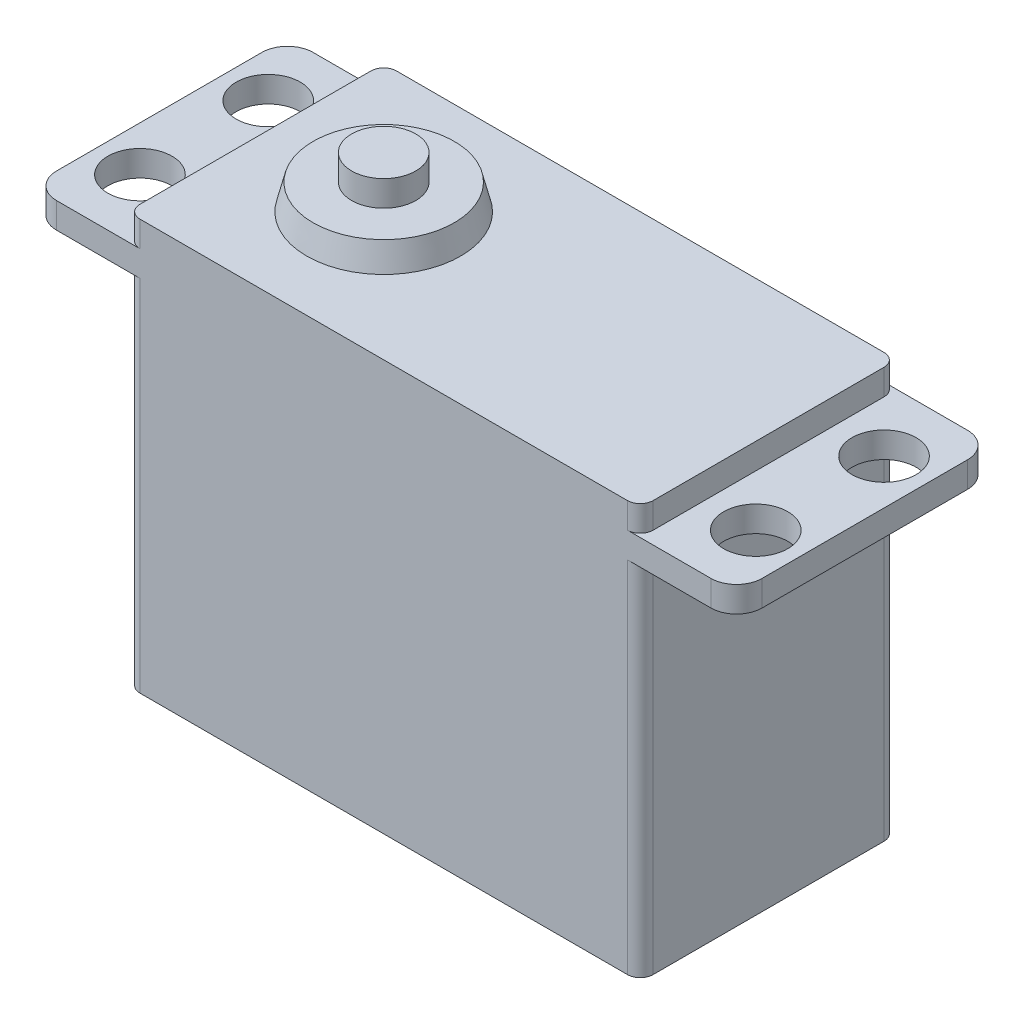
ISO-10303-21;
HEADER;
FILE_DESCRIPTION(('STEP AP214'),'2;1');
FILE_NAME('part.step','',(''),(''),'','','');
FILE_SCHEMA(('AUTOMOTIVE_DESIGN { 1 0 10303 214 1 1 1 1 }'));
ENDSEC;
DATA;
#1=APPLICATION_CONTEXT('core data for automotive mechanical design processes');
#2=APPLICATION_PROTOCOL_DEFINITION('international standard','automotive_design',2000,#1);
#3=PRODUCT_CONTEXT('',#1,'mechanical');
#4=PRODUCT('Part','Part','',(#3));
#5=PRODUCT_RELATED_PRODUCT_CATEGORY('part','',(#4));
#6=PRODUCT_DEFINITION_FORMATION('','',#4);
#7=PRODUCT_DEFINITION_CONTEXT('part definition',#1,'design');
#8=PRODUCT_DEFINITION('design','',#6,#7);
#9=PRODUCT_DEFINITION_SHAPE('','',#8);
#10=(LENGTH_UNIT() NAMED_UNIT(*) SI_UNIT(.MILLI.,.METRE.));
#11=(NAMED_UNIT(*) PLANE_ANGLE_UNIT() SI_UNIT($,.RADIAN.));
#12=(NAMED_UNIT(*) SI_UNIT($,.STERADIAN.) SOLID_ANGLE_UNIT());
#13=UNCERTAINTY_MEASURE_WITH_UNIT(LENGTH_MEASURE(1.E-05),#10,'distance_accuracy_value','');
#14=(GEOMETRIC_REPRESENTATION_CONTEXT(3) GLOBAL_UNCERTAINTY_ASSIGNED_CONTEXT((#13)) GLOBAL_UNIT_ASSIGNED_CONTEXT((#10,
#11,#12)) REPRESENTATION_CONTEXT('',''));
#15=CARTESIAN_POINT('',(0.,0.,0.));
#16=DIRECTION('',(0.,0.,1.));
#17=DIRECTION('',(1.,0.,0.));
#18=AXIS2_PLACEMENT_3D('',#15,#16,#17);
#19=CARTESIAN_POINT('',(0.,2.,0.));
#20=DIRECTION('',(0.,-1.,0.));
#21=DIRECTION('',(0.,0.,-1.));
#22=AXIS2_PLACEMENT_3D('',#19,#20,#21);
#23=PLANE('',#22);
#24=CARTESIAN_POINT('',(3.5,2.,-5.));
#25=DIRECTION('',(0.,1.,0.));
#26=DIRECTION('',(0.,0.,1.));
#27=AXIS2_PLACEMENT_3D('',#24,#25,#26);
#28=CIRCLE('',#27,2.5);
#29=CARTESIAN_POINT('',(3.5,2.,-2.5));
#30=VERTEX_POINT('',#29);
#31=EDGE_CURVE('E376',#30,#30,#28,.T.);
#32=ORIENTED_EDGE('',*,*,#31,.F.);
#33=EDGE_LOOP('',(#32));
#34=FACE_BOUND('',#33,.T.);
#35=CARTESIAN_POINT('',(3.5,2.,-15.));
#36=DIRECTION('',(0.,1.,0.));
#37=DIRECTION('',(0.,0.,1.));
#38=AXIS2_PLACEMENT_3D('',#35,#36,#37);
#39=CIRCLE('',#38,2.5);
#40=CARTESIAN_POINT('',(3.5,2.,-12.5));
#41=VERTEX_POINT('',#40);
#42=EDGE_CURVE('E382',#41,#41,#39,.T.);
#43=ORIENTED_EDGE('',*,*,#42,.F.);
#44=EDGE_LOOP('',(#43));
#45=FACE_BOUND('',#44,.T.);
#46=DIRECTION('',(0.,0.,1.));
#47=VECTOR('',#46,1.);
#48=CARTESIAN_POINT('',(7.5,2.,-20.));
#49=LINE('',#48,#47);
#50=CARTESIAN_POINT('',(7.5,2.,-19.));
#51=VERTEX_POINT('',#50);
#52=CARTESIAN_POINT('',(7.5,2.,-1.));
#53=VERTEX_POINT('',#52);
#54=EDGE_CURVE('E734',#51,#53,#49,.T.);
#55=ORIENTED_EDGE('',*,*,#54,.F.);
#56=CARTESIAN_POINT('',(8.5,2.,-19.));
#57=DIRECTION('',(0.,-1.,0.));
#58=DIRECTION('',(0.,0.,-1.));
#59=AXIS2_PLACEMENT_3D('',#56,#57,#58);
#60=CIRCLE('',#59,1.);
#61=CARTESIAN_POINT('',(8.5,2.,-20.));
#62=VERTEX_POINT('',#61);
#63=EDGE_CURVE('E324',#51,#62,#60,.T.);
#64=ORIENTED_EDGE('',*,*,#63,.T.);
#65=DIRECTION('',(-1.,0.,0.));
#66=VECTOR('',#65,1.);
#67=CARTESIAN_POINT('',(0.,2.,-20.));
#68=LINE('',#67,#66);
#69=CARTESIAN_POINT('',(2.,2.,-20.));
#70=VERTEX_POINT('',#69);
#71=EDGE_CURVE('E393',#62,#70,#68,.T.);
#72=ORIENTED_EDGE('',*,*,#71,.T.);
#73=CARTESIAN_POINT('',(2.,2.,-18.));
#74=DIRECTION('',(0.,-1.,0.));
#75=DIRECTION('',(0.,0.,-1.));
#76=AXIS2_PLACEMENT_3D('',#73,#74,#75);
#77=CIRCLE('',#76,2.);
#78=CARTESIAN_POINT('',(0.,2.,-18.));
#79=VERTEX_POINT('',#78);
#80=EDGE_CURVE('E246',#70,#79,#77,.F.);
#81=ORIENTED_EDGE('',*,*,#80,.T.);
#82=DIRECTION('',(0.,0.,1.));
#83=VECTOR('',#82,1.);
#84=CARTESIAN_POINT('',(0.,2.,0.));
#85=LINE('',#84,#83);
#86=CARTESIAN_POINT('',(0.,2.,-2.));
#87=VERTEX_POINT('',#86);
#88=EDGE_CURVE('E225',#79,#87,#85,.T.);
#89=ORIENTED_EDGE('',*,*,#88,.T.);
#90=CARTESIAN_POINT('',(2.,2.,-2.));
#91=DIRECTION('',(0.,-1.,0.));
#92=DIRECTION('',(0.,0.,-1.));
#93=AXIS2_PLACEMENT_3D('',#90,#91,#92);
#94=CIRCLE('',#93,2.);
#95=CARTESIAN_POINT('',(2.,2.,0.));
#96=VERTEX_POINT('',#95);
#97=EDGE_CURVE('E248',#87,#96,#94,.F.);
#98=ORIENTED_EDGE('',*,*,#97,.T.);
#99=DIRECTION('',(1.,0.,0.));
#100=VECTOR('',#99,1.);
#101=CARTESIAN_POINT('',(0.,2.,0.));
#102=LINE('',#101,#100);
#103=CARTESIAN_POINT('',(8.5,2.,0.));
#104=VERTEX_POINT('',#103);
#105=EDGE_CURVE('E388',#96,#104,#102,.T.);
#106=ORIENTED_EDGE('',*,*,#105,.T.);
#107=CARTESIAN_POINT('',(8.5,2.,-1.));
#108=DIRECTION('',(0.,-1.,0.));
#109=DIRECTION('',(0.,0.,-1.));
#110=AXIS2_PLACEMENT_3D('',#107,#108,#109);
#111=CIRCLE('',#110,1.);
#112=EDGE_CURVE('E327',#104,#53,#111,.T.);
#113=ORIENTED_EDGE('',*,*,#112,.T.);
#114=EDGE_LOOP('',(#55,#64,#72,#81,#89,#98,#106,#113));
#115=FACE_BOUND('',#114,.T.);
#116=ADVANCED_FACE('F33',(#34,#45,#115),#23,.F.);
#117=CARTESIAN_POINT('',(51.5,2.,-5.));
#118=DIRECTION('',(0.,1.,0.));
#119=DIRECTION('',(0.,0.,1.));
#120=AXIS2_PLACEMENT_3D('',#117,#118,#119);
#121=CIRCLE('',#120,2.5);
#122=CARTESIAN_POINT('',(51.5,2.,-2.5));
#123=VERTEX_POINT('',#122);
#124=EDGE_CURVE('E355',#123,#123,#121,.T.);
#125=ORIENTED_EDGE('',*,*,#124,.F.);
#126=EDGE_LOOP('',(#125));
#127=FACE_BOUND('',#126,.T.);
#128=CARTESIAN_POINT('',(51.5,2.,-15.));
#129=DIRECTION('',(0.,1.,0.));
#130=DIRECTION('',(0.,0.,1.));
#131=AXIS2_PLACEMENT_3D('',#128,#129,#130);
#132=CIRCLE('',#131,2.5);
#133=CARTESIAN_POINT('',(51.5,2.,-12.5));
#134=VERTEX_POINT('',#133);
#135=EDGE_CURVE('E370',#134,#134,#132,.T.);
#136=ORIENTED_EDGE('',*,*,#135,.F.);
#137=EDGE_LOOP('',(#136));
#138=FACE_BOUND('',#137,.T.);
#139=DIRECTION('',(0.,0.,-1.));
#140=VECTOR('',#139,1.);
#141=CARTESIAN_POINT('',(47.5,2.,-20.));
#142=LINE('',#141,#140);
#143=CARTESIAN_POINT('',(47.5,2.,-1.));
#144=VERTEX_POINT('',#143);
#145=CARTESIAN_POINT('',(47.5,2.,-19.));
#146=VERTEX_POINT('',#145);
#147=EDGE_CURVE('E739',#144,#146,#142,.T.);
#148=ORIENTED_EDGE('',*,*,#147,.F.);
#149=CARTESIAN_POINT('',(46.5,2.,-1.));
#150=DIRECTION('',(0.,-1.,0.));
#151=DIRECTION('',(0.,0.,-1.));
#152=AXIS2_PLACEMENT_3D('',#149,#150,#151);
#153=CIRCLE('',#152,1.);
#154=CARTESIAN_POINT('',(46.5,2.,0.));
#155=VERTEX_POINT('',#154);
#156=EDGE_CURVE('E321',#144,#155,#153,.T.);
#157=ORIENTED_EDGE('',*,*,#156,.T.);
#158=CARTESIAN_POINT('',(53.,2.,0.));
#159=VERTEX_POINT('',#158);
#160=EDGE_CURVE('E229',#155,#159,#102,.T.);
#161=ORIENTED_EDGE('',*,*,#160,.T.);
#162=CARTESIAN_POINT('',(53.,2.,-2.));
#163=DIRECTION('',(0.,-1.,0.));
#164=DIRECTION('',(0.,0.,-1.));
#165=AXIS2_PLACEMENT_3D('',#162,#163,#164);
#166=CIRCLE('',#165,2.);
#167=CARTESIAN_POINT('',(55.,2.,-2.));
#168=VERTEX_POINT('',#167);
#169=EDGE_CURVE('E250',#159,#168,#166,.F.);
#170=ORIENTED_EDGE('',*,*,#169,.T.);
#171=DIRECTION('',(0.,0.,-1.));
#172=VECTOR('',#171,1.);
#173=CARTESIAN_POINT('',(55.,2.,0.));
#174=LINE('',#173,#172);
#175=CARTESIAN_POINT('',(55.,2.,-18.));
#176=VERTEX_POINT('',#175);
#177=EDGE_CURVE('E390',#168,#176,#174,.T.);
#178=ORIENTED_EDGE('',*,*,#177,.T.);
#179=CARTESIAN_POINT('',(53.,2.,-18.));
#180=DIRECTION('',(0.,-1.,0.));
#181=DIRECTION('',(0.,0.,-1.));
#182=AXIS2_PLACEMENT_3D('',#179,#180,#181);
#183=CIRCLE('',#182,2.);
#184=CARTESIAN_POINT('',(53.,2.,-20.));
#185=VERTEX_POINT('',#184);
#186=EDGE_CURVE('E252',#176,#185,#183,.F.);
#187=ORIENTED_EDGE('',*,*,#186,.T.);
#188=CARTESIAN_POINT('',(46.5,2.,-20.));
#189=VERTEX_POINT('',#188);
#190=EDGE_CURVE('E216',#185,#189,#68,.T.);
#191=ORIENTED_EDGE('',*,*,#190,.T.);
#192=CARTESIAN_POINT('',(46.5,2.,-19.));
#193=DIRECTION('',(0.,-1.,0.));
#194=DIRECTION('',(0.,0.,-1.));
#195=AXIS2_PLACEMENT_3D('',#192,#193,#194);
#196=CIRCLE('',#195,1.);
#197=EDGE_CURVE('E319',#189,#146,#196,.T.);
#198=ORIENTED_EDGE('',*,*,#197,.T.);
#199=EDGE_LOOP('',(#148,#157,#161,#170,#178,#187,#191,#198));
#200=FACE_BOUND('',#199,.T.);
#201=ADVANCED_FACE('F406',(#127,#138,#200),#23,.F.);
#202=CARTESIAN_POINT('',(0.,0.,0.));
#203=DIRECTION('',(0.,-1.,0.));
#204=DIRECTION('',(0.,0.,-1.));
#205=AXIS2_PLACEMENT_3D('',#202,#203,#204);
#206=PLANE('',#205);
#207=DIRECTION('',(0.,0.,-1.));
#208=VECTOR('',#207,1.);
#209=CARTESIAN_POINT('',(7.5,0.,0.));
#210=LINE('',#209,#208);
#211=CARTESIAN_POINT('',(7.5,0.,-1.));
#212=VERTEX_POINT('',#211);
#213=CARTESIAN_POINT('',(7.5,0.,-19.));
#214=VERTEX_POINT('',#213);
#215=EDGE_CURVE('E336',#212,#214,#210,.T.);
#216=ORIENTED_EDGE('',*,*,#215,.F.);
#217=CARTESIAN_POINT('',(8.5,0.,-1.));
#218=DIRECTION('',(0.,-1.,0.));
#219=DIRECTION('',(0.,0.,-1.));
#220=AXIS2_PLACEMENT_3D('',#217,#218,#219);
#221=CIRCLE('',#220,1.);
#222=CARTESIAN_POINT('',(8.5,0.,0.));
#223=VERTEX_POINT('',#222);
#224=EDGE_CURVE('E41',#212,#223,#221,.F.);
#225=ORIENTED_EDGE('',*,*,#224,.T.);
#226=DIRECTION('',(1.,0.,0.));
#227=VECTOR('',#226,1.);
#228=CARTESIAN_POINT('',(0.,0.,0.));
#229=LINE('',#228,#227);
#230=CARTESIAN_POINT('',(2.,0.,0.));
#231=VERTEX_POINT('',#230);
#232=EDGE_CURVE('E335',#231,#223,#229,.T.);
#233=ORIENTED_EDGE('',*,*,#232,.F.);
#234=CARTESIAN_POINT('',(2.,0.,-2.));
#235=DIRECTION('',(0.,-1.,0.));
#236=DIRECTION('',(0.,0.,-1.));
#237=AXIS2_PLACEMENT_3D('',#234,#235,#236);
#238=CIRCLE('',#237,2.);
#239=CARTESIAN_POINT('',(0.,0.,-2.));
#240=VERTEX_POINT('',#239);
#241=EDGE_CURVE('E239',#231,#240,#238,.T.);
#242=ORIENTED_EDGE('',*,*,#241,.T.);
#243=DIRECTION('',(0.,0.,1.));
#244=VECTOR('',#243,1.);
#245=CARTESIAN_POINT('',(0.,0.,0.));
#246=LINE('',#245,#244);
#247=CARTESIAN_POINT('',(0.,0.,-18.));
#248=VERTEX_POINT('',#247);
#249=EDGE_CURVE('E385',#248,#240,#246,.T.);
#250=ORIENTED_EDGE('',*,*,#249,.F.);
#251=CARTESIAN_POINT('',(2.,0.,-18.));
#252=DIRECTION('',(0.,-1.,0.));
#253=DIRECTION('',(0.,0.,-1.));
#254=AXIS2_PLACEMENT_3D('',#251,#252,#253);
#255=CIRCLE('',#254,2.);
#256=CARTESIAN_POINT('',(2.,0.,-20.));
#257=VERTEX_POINT('',#256);
#258=EDGE_CURVE('E217',#248,#257,#255,.T.);
#259=ORIENTED_EDGE('',*,*,#258,.T.);
#260=DIRECTION('',(-1.,0.,0.));
#261=VECTOR('',#260,1.);
#262=CARTESIAN_POINT('',(0.,0.,-20.));
#263=LINE('',#262,#261);
#264=CARTESIAN_POINT('',(8.5,0.,-20.));
#265=VERTEX_POINT('',#264);
#266=EDGE_CURVE('E226',#265,#257,#263,.T.);
#267=ORIENTED_EDGE('',*,*,#266,.F.);
#268=CARTESIAN_POINT('',(8.5,0.,-19.));
#269=DIRECTION('',(0.,-1.,0.));
#270=DIRECTION('',(0.,0.,-1.));
#271=AXIS2_PLACEMENT_3D('',#268,#269,#270);
#272=CIRCLE('',#271,1.);
#273=EDGE_CURVE('E48',#265,#214,#272,.F.);
#274=ORIENTED_EDGE('',*,*,#273,.T.);
#275=EDGE_LOOP('',(#216,#225,#233,#242,#250,#259,#267,#274));
#276=FACE_BOUND('',#275,.T.);
#277=CARTESIAN_POINT('',(3.5,0.,-5.));
#278=DIRECTION('',(0.,1.,0.));
#279=DIRECTION('',(0.,0.,1.));
#280=AXIS2_PLACEMENT_3D('',#277,#278,#279);
#281=CIRCLE('',#280,2.5);
#282=CARTESIAN_POINT('',(3.5,0.,-2.5));
#283=VERTEX_POINT('',#282);
#284=EDGE_CURVE('E373',#283,#283,#281,.T.);
#285=ORIENTED_EDGE('',*,*,#284,.T.);
#286=EDGE_LOOP('',(#285));
#287=FACE_BOUND('',#286,.T.);
#288=CARTESIAN_POINT('',(3.5,0.,-15.));
#289=DIRECTION('',(0.,1.,0.));
#290=DIRECTION('',(0.,0.,1.));
#291=AXIS2_PLACEMENT_3D('',#288,#289,#290);
#292=CIRCLE('',#291,2.5);
#293=CARTESIAN_POINT('',(3.5,0.,-12.5));
#294=VERTEX_POINT('',#293);
#295=EDGE_CURVE('E379',#294,#294,#292,.T.);
#296=ORIENTED_EDGE('',*,*,#295,.T.);
#297=EDGE_LOOP('',(#296));
#298=FACE_BOUND('',#297,.T.);
#299=ADVANCED_FACE('F333',(#276,#287,#298),#206,.T.);
#300=DIRECTION('',(0.,0.,1.));
#301=VECTOR('',#300,1.);
#302=CARTESIAN_POINT('',(47.5,0.,0.));
#303=LINE('',#302,#301);
#304=CARTESIAN_POINT('',(47.5,0.,-19.));
#305=VERTEX_POINT('',#304);
#306=CARTESIAN_POINT('',(47.5,0.,-1.));
#307=VERTEX_POINT('',#306);
#308=EDGE_CURVE('E362',#305,#307,#303,.T.);
#309=ORIENTED_EDGE('',*,*,#308,.F.);
#310=CARTESIAN_POINT('',(46.5,0.,-19.));
#311=DIRECTION('',(0.,-1.,0.));
#312=DIRECTION('',(0.,0.,-1.));
#313=AXIS2_PLACEMENT_3D('',#310,#311,#312);
#314=CIRCLE('',#313,1.);
#315=CARTESIAN_POINT('',(46.5,0.,-20.));
#316=VERTEX_POINT('',#315);
#317=EDGE_CURVE('E223',#305,#316,#314,.F.);
#318=ORIENTED_EDGE('',*,*,#317,.T.);
#319=CARTESIAN_POINT('',(53.,0.,-20.));
#320=VERTEX_POINT('',#319);
#321=EDGE_CURVE('E213',#320,#316,#263,.T.);
#322=ORIENTED_EDGE('',*,*,#321,.F.);
#323=CARTESIAN_POINT('',(53.,0.,-18.));
#324=DIRECTION('',(0.,-1.,0.));
#325=DIRECTION('',(0.,0.,-1.));
#326=AXIS2_PLACEMENT_3D('',#323,#324,#325);
#327=CIRCLE('',#326,2.);
#328=CARTESIAN_POINT('',(55.,0.,-18.));
#329=VERTEX_POINT('',#328);
#330=EDGE_CURVE('E196',#320,#329,#327,.T.);
#331=ORIENTED_EDGE('',*,*,#330,.T.);
#332=DIRECTION('',(0.,0.,-1.));
#333=VECTOR('',#332,1.);
#334=CARTESIAN_POINT('',(55.,0.,0.));
#335=LINE('',#334,#333);
#336=CARTESIAN_POINT('',(55.,0.,-2.));
#337=VERTEX_POINT('',#336);
#338=EDGE_CURVE('E231',#337,#329,#335,.T.);
#339=ORIENTED_EDGE('',*,*,#338,.F.);
#340=CARTESIAN_POINT('',(53.,0.,-2.));
#341=DIRECTION('',(0.,-1.,0.));
#342=DIRECTION('',(0.,0.,-1.));
#343=AXIS2_PLACEMENT_3D('',#340,#341,#342);
#344=CIRCLE('',#343,2.);
#345=CARTESIAN_POINT('',(53.,0.,0.));
#346=VERTEX_POINT('',#345);
#347=EDGE_CURVE('E207',#337,#346,#344,.T.);
#348=ORIENTED_EDGE('',*,*,#347,.T.);
#349=CARTESIAN_POINT('',(46.5,0.,0.));
#350=VERTEX_POINT('',#349);
#351=EDGE_CURVE('E396',#350,#346,#229,.T.);
#352=ORIENTED_EDGE('',*,*,#351,.F.);
#353=CARTESIAN_POINT('',(46.5,0.,-1.));
#354=DIRECTION('',(0.,-1.,0.));
#355=DIRECTION('',(0.,0.,-1.));
#356=AXIS2_PLACEMENT_3D('',#353,#354,#355);
#357=CIRCLE('',#356,1.);
#358=EDGE_CURVE('E331',#350,#307,#357,.F.);
#359=ORIENTED_EDGE('',*,*,#358,.T.);
#360=EDGE_LOOP('',(#309,#318,#322,#331,#339,#348,#352,#359));
#361=FACE_BOUND('',#360,.T.);
#362=CARTESIAN_POINT('',(51.5,0.,-15.));
#363=DIRECTION('',(0.,1.,0.));
#364=DIRECTION('',(0.,0.,1.));
#365=AXIS2_PLACEMENT_3D('',#362,#363,#364);
#366=CIRCLE('',#365,2.5);
#367=CARTESIAN_POINT('',(51.5,0.,-12.5));
#368=VERTEX_POINT('',#367);
#369=EDGE_CURVE('E368',#368,#368,#366,.T.);
#370=ORIENTED_EDGE('',*,*,#369,.T.);
#371=EDGE_LOOP('',(#370));
#372=FACE_BOUND('',#371,.T.);
#373=CARTESIAN_POINT('',(51.5,0.,-5.));
#374=DIRECTION('',(0.,1.,0.));
#375=DIRECTION('',(0.,0.,1.));
#376=AXIS2_PLACEMENT_3D('',#373,#374,#375);
#377=CIRCLE('',#376,2.5);
#378=CARTESIAN_POINT('',(51.5,0.,-2.5));
#379=VERTEX_POINT('',#378);
#380=EDGE_CURVE('E351',#379,#379,#377,.T.);
#381=ORIENTED_EDGE('',*,*,#380,.T.);
#382=EDGE_LOOP('',(#381));
#383=FACE_BOUND('',#382,.T.);
#384=ADVANCED_FACE('F221',(#361,#372,#383),#206,.T.);
#385=CARTESIAN_POINT('',(0.,2.,0.));
#386=DIRECTION('',(1.,0.,0.));
#387=DIRECTION('',(0.,0.,-1.));
#388=AXIS2_PLACEMENT_3D('',#385,#386,#387);
#389=PLANE('',#388);
#390=ORIENTED_EDGE('',*,*,#249,.T.);
#391=DIRECTION('',(0.,-1.,0.));
#392=VECTOR('',#391,1.);
#393=CARTESIAN_POINT('',(0.,2.,-2.));
#394=LINE('',#393,#392);
#395=EDGE_CURVE('E263',#240,#87,#394,.F.);
#396=ORIENTED_EDGE('',*,*,#395,.T.);
#397=ORIENTED_EDGE('',*,*,#88,.F.);
#398=DIRECTION('',(0.,-1.,0.));
#399=VECTOR('',#398,1.);
#400=CARTESIAN_POINT('',(0.,2.,-18.));
#401=LINE('',#400,#399);
#402=EDGE_CURVE('E260',#79,#248,#401,.T.);
#403=ORIENTED_EDGE('',*,*,#402,.T.);
#404=EDGE_LOOP('',(#390,#396,#397,#403));
#405=FACE_BOUND('',#404,.T.);
#406=ADVANCED_FACE('F417',(#405),#389,.F.);
#407=CARTESIAN_POINT('',(0.,2.,0.));
#408=DIRECTION('',(0.,0.,-1.));
#409=DIRECTION('',(-1.,0.,0.));
#410=AXIS2_PLACEMENT_3D('',#407,#408,#409);
#411=PLANE('',#410);
#412=ORIENTED_EDGE('',*,*,#160,.F.);
#413=DIRECTION('',(0.,-1.,0.));
#414=VECTOR('',#413,1.);
#415=CARTESIAN_POINT('',(46.5,2.,0.));
#416=LINE('',#415,#414);
#417=CARTESIAN_POINT('',(46.5,4.,0.));
#418=VERTEX_POINT('',#417);
#419=EDGE_CURVE('E295',#155,#418,#416,.F.);
#420=ORIENTED_EDGE('',*,*,#419,.T.);
#421=DIRECTION('',(1.,0.,0.));
#422=VECTOR('',#421,1.);
#423=CARTESIAN_POINT('',(7.5,4.,0.));
#424=LINE('',#423,#422);
#425=CARTESIAN_POINT('',(8.5,4.,0.));
#426=VERTEX_POINT('',#425);
#427=EDGE_CURVE('E738',#426,#418,#424,.T.);
#428=ORIENTED_EDGE('',*,*,#427,.F.);
#429=DIRECTION('',(0.,-1.,0.));
#430=VECTOR('',#429,1.);
#431=CARTESIAN_POINT('',(8.5,2.,0.));
#432=LINE('',#431,#430);
#433=EDGE_CURVE('E292',#426,#104,#432,.T.);
#434=ORIENTED_EDGE('',*,*,#433,.T.);
#435=ORIENTED_EDGE('',*,*,#105,.F.);
#436=DIRECTION('',(0.,-1.,0.));
#437=VECTOR('',#436,1.);
#438=CARTESIAN_POINT('',(2.,2.,0.));
#439=LINE('',#438,#437);
#440=EDGE_CURVE('E254',#96,#231,#439,.T.);
#441=ORIENTED_EDGE('',*,*,#440,.T.);
#442=ORIENTED_EDGE('',*,*,#232,.T.);
#443=DIRECTION('',(0.,1.,0.));
#444=VECTOR('',#443,1.);
#445=CARTESIAN_POINT('',(8.5,2.,0.));
#446=LINE('',#445,#444);
#447=CARTESIAN_POINT('',(8.5,-28.,0.));
#448=VERTEX_POINT('',#447);
#449=EDGE_CURVE('E287',#223,#448,#446,.F.);
#450=ORIENTED_EDGE('',*,*,#449,.T.);
#451=DIRECTION('',(-1.,0.,0.));
#452=VECTOR('',#451,1.);
#453=CARTESIAN_POINT('',(7.5,-28.,0.));
#454=LINE('',#453,#452);
#455=CARTESIAN_POINT('',(46.5,-28.,0.));
#456=VERTEX_POINT('',#455);
#457=EDGE_CURVE('E342',#456,#448,#454,.T.);
#458=ORIENTED_EDGE('',*,*,#457,.F.);
#459=DIRECTION('',(0.,1.,0.));
#460=VECTOR('',#459,1.);
#461=CARTESIAN_POINT('',(46.5,2.,0.));
#462=LINE('',#461,#460);
#463=EDGE_CURVE('E289',#456,#350,#462,.T.);
#464=ORIENTED_EDGE('',*,*,#463,.T.);
#465=ORIENTED_EDGE('',*,*,#351,.T.);
#466=DIRECTION('',(0.,-1.,0.));
#467=VECTOR('',#466,1.);
#468=CARTESIAN_POINT('',(53.,2.,0.));
#469=LINE('',#468,#467);
#470=EDGE_CURVE('E257',#346,#159,#469,.F.);
#471=ORIENTED_EDGE('',*,*,#470,.T.);
#472=EDGE_LOOP('',(#412,#420,#428,#434,#435,#441,#442,#450,#458,#464,#465,#471));
#473=FACE_BOUND('',#472,.T.);
#474=ADVANCED_FACE('F341',(#473),#411,.F.);
#475=CARTESIAN_POINT('',(55.,2.,0.));
#476=DIRECTION('',(-1.,0.,0.));
#477=DIRECTION('',(0.,0.,1.));
#478=AXIS2_PLACEMENT_3D('',#475,#476,#477);
#479=PLANE('',#478);
#480=ORIENTED_EDGE('',*,*,#338,.T.);
#481=DIRECTION('',(0.,-1.,0.));
#482=VECTOR('',#481,1.);
#483=CARTESIAN_POINT('',(55.,2.,-18.));
#484=LINE('',#483,#482);
#485=EDGE_CURVE('E201',#329,#176,#484,.F.);
#486=ORIENTED_EDGE('',*,*,#485,.T.);
#487=ORIENTED_EDGE('',*,*,#177,.F.);
#488=DIRECTION('',(0.,-1.,0.));
#489=VECTOR('',#488,1.);
#490=CARTESIAN_POINT('',(55.,2.,-2.));
#491=LINE('',#490,#489);
#492=EDGE_CURVE('E206',#168,#337,#491,.T.);
#493=ORIENTED_EDGE('',*,*,#492,.T.);
#494=EDGE_LOOP('',(#480,#486,#487,#493));
#495=FACE_BOUND('',#494,.T.);
#496=ADVANCED_FACE('F408',(#495),#479,.F.);
#497=CARTESIAN_POINT('',(0.,2.,-20.));
#498=DIRECTION('',(0.,0.,1.));
#499=DIRECTION('',(1.,0.,0.));
#500=AXIS2_PLACEMENT_3D('',#497,#498,#499);
#501=PLANE('',#500);
#502=DIRECTION('',(-1.,0.,0.));
#503=VECTOR('',#502,1.);
#504=CARTESIAN_POINT('',(7.5,4.,-20.));
#505=LINE('',#504,#503);
#506=CARTESIAN_POINT('',(46.5,4.,-20.));
#507=VERTEX_POINT('',#506);
#508=CARTESIAN_POINT('',(8.5,4.,-20.));
#509=VERTEX_POINT('',#508);
#510=EDGE_CURVE('E363',#507,#509,#505,.T.);
#511=ORIENTED_EDGE('',*,*,#510,.F.);
#512=DIRECTION('',(0.,-1.,0.));
#513=VECTOR('',#512,1.);
#514=CARTESIAN_POINT('',(46.5,2.,-20.));
#515=LINE('',#514,#513);
#516=EDGE_CURVE('E272',#507,#189,#515,.T.);
#517=ORIENTED_EDGE('',*,*,#516,.T.);
#518=ORIENTED_EDGE('',*,*,#190,.F.);
#519=DIRECTION('',(0.,-1.,0.));
#520=VECTOR('',#519,1.);
#521=CARTESIAN_POINT('',(53.,2.,-20.));
#522=LINE('',#521,#520);
#523=EDGE_CURVE('E200',#185,#320,#522,.T.);
#524=ORIENTED_EDGE('',*,*,#523,.T.);
#525=ORIENTED_EDGE('',*,*,#321,.T.);
#526=DIRECTION('',(0.,1.,0.));
#527=VECTOR('',#526,1.);
#528=CARTESIAN_POINT('',(46.5,2.,-20.));
#529=LINE('',#528,#527);
#530=CARTESIAN_POINT('',(46.5,-28.,-20.));
#531=VERTEX_POINT('',#530);
#532=EDGE_CURVE('E268',#316,#531,#529,.F.);
#533=ORIENTED_EDGE('',*,*,#532,.T.);
#534=DIRECTION('',(1.,0.,0.));
#535=VECTOR('',#534,1.);
#536=CARTESIAN_POINT('',(7.5,-28.,-20.));
#537=LINE('',#536,#535);
#538=CARTESIAN_POINT('',(8.5,-28.,-20.));
#539=VERTEX_POINT('',#538);
#540=EDGE_CURVE('E357',#539,#531,#537,.T.);
#541=ORIENTED_EDGE('',*,*,#540,.F.);
#542=DIRECTION('',(0.,1.,0.));
#543=VECTOR('',#542,1.);
#544=CARTESIAN_POINT('',(8.5,2.,-20.));
#545=LINE('',#544,#543);
#546=EDGE_CURVE('E265',#539,#265,#545,.T.);
#547=ORIENTED_EDGE('',*,*,#546,.T.);
#548=ORIENTED_EDGE('',*,*,#266,.T.);
#549=DIRECTION('',(0.,-1.,0.));
#550=VECTOR('',#549,1.);
#551=CARTESIAN_POINT('',(2.,2.,-20.));
#552=LINE('',#551,#550);
#553=EDGE_CURVE('E218',#257,#70,#552,.F.);
#554=ORIENTED_EDGE('',*,*,#553,.T.);
#555=ORIENTED_EDGE('',*,*,#71,.F.);
#556=DIRECTION('',(0.,-1.,0.));
#557=VECTOR('',#556,1.);
#558=CARTESIAN_POINT('',(8.5,2.,-20.));
#559=LINE('',#558,#557);
#560=EDGE_CURVE('E270',#62,#509,#559,.F.);
#561=ORIENTED_EDGE('',*,*,#560,.T.);
#562=EDGE_LOOP('',(#511,#517,#518,#524,#525,#533,#541,#547,#548,#554,#555,#561));
#563=FACE_BOUND('',#562,.T.);
#564=ADVANCED_FACE('F212',(#563),#501,.F.);
#565=CARTESIAN_POINT('',(3.5,2.,-15.));
#566=DIRECTION('',(0.,-1.,0.));
#567=DIRECTION('',(0.,0.,-1.));
#568=AXIS2_PLACEMENT_3D('',#565,#566,#567);
#569=CYLINDRICAL_SURFACE('',#568,2.5);
#570=ORIENTED_EDGE('',*,*,#42,.T.);
#571=EDGE_LOOP('',(#570));
#572=FACE_BOUND('',#571,.T.);
#573=ORIENTED_EDGE('',*,*,#295,.F.);
#574=EDGE_LOOP('',(#573));
#575=FACE_BOUND('',#574,.T.);
#576=ADVANCED_FACE('F415',(#572,#575),#569,.F.);
#577=CARTESIAN_POINT('',(3.5,2.,-5.));
#578=DIRECTION('',(0.,-1.,0.));
#579=DIRECTION('',(0.,0.,-1.));
#580=AXIS2_PLACEMENT_3D('',#577,#578,#579);
#581=CYLINDRICAL_SURFACE('',#580,2.5);
#582=ORIENTED_EDGE('',*,*,#31,.T.);
#583=EDGE_LOOP('',(#582));
#584=FACE_BOUND('',#583,.T.);
#585=ORIENTED_EDGE('',*,*,#284,.F.);
#586=EDGE_LOOP('',(#585));
#587=FACE_BOUND('',#586,.T.);
#588=ADVANCED_FACE('F521',(#584,#587),#581,.F.);
#589=CARTESIAN_POINT('',(51.5,2.,-15.));
#590=DIRECTION('',(0.,-1.,0.));
#591=DIRECTION('',(0.,0.,-1.));
#592=AXIS2_PLACEMENT_3D('',#589,#590,#591);
#593=CYLINDRICAL_SURFACE('',#592,2.5);
#594=ORIENTED_EDGE('',*,*,#135,.T.);
#595=EDGE_LOOP('',(#594));
#596=FACE_BOUND('',#595,.T.);
#597=ORIENTED_EDGE('',*,*,#369,.F.);
#598=EDGE_LOOP('',(#597));
#599=FACE_BOUND('',#598,.T.);
#600=ADVANCED_FACE('F511',(#596,#599),#593,.F.);
#601=CARTESIAN_POINT('',(51.5,2.,-5.));
#602=DIRECTION('',(0.,-1.,0.));
#603=DIRECTION('',(0.,0.,-1.));
#604=AXIS2_PLACEMENT_3D('',#601,#602,#603);
#605=CYLINDRICAL_SURFACE('',#604,2.5);
#606=ORIENTED_EDGE('',*,*,#124,.T.);
#607=EDGE_LOOP('',(#606));
#608=FACE_BOUND('',#607,.T.);
#609=ORIENTED_EDGE('',*,*,#380,.F.);
#610=EDGE_LOOP('',(#609));
#611=FACE_BOUND('',#610,.T.);
#612=ADVANCED_FACE('F488',(#608,#611),#605,.F.);
#613=CARTESIAN_POINT('',(53.,2.,-18.));
#614=DIRECTION('',(0.,-1.,0.));
#615=DIRECTION('',(0.,0.,-1.));
#616=AXIS2_PLACEMENT_3D('',#613,#614,#615);
#617=CYLINDRICAL_SURFACE('',#616,2.);
#618=ORIENTED_EDGE('',*,*,#186,.F.);
#619=ORIENTED_EDGE('',*,*,#485,.F.);
#620=ORIENTED_EDGE('',*,*,#330,.F.);
#621=ORIENTED_EDGE('',*,*,#523,.F.);
#622=EDGE_LOOP('',(#618,#619,#620,#621));
#623=FACE_BOUND('',#622,.T.);
#624=ADVANCED_FACE('F199',(#623),#617,.T.);
#625=CARTESIAN_POINT('',(53.,2.,-2.));
#626=DIRECTION('',(0.,-1.,0.));
#627=DIRECTION('',(0.,0.,-1.));
#628=AXIS2_PLACEMENT_3D('',#625,#626,#627);
#629=CYLINDRICAL_SURFACE('',#628,2.);
#630=ORIENTED_EDGE('',*,*,#169,.F.);
#631=ORIENTED_EDGE('',*,*,#470,.F.);
#632=ORIENTED_EDGE('',*,*,#347,.F.);
#633=ORIENTED_EDGE('',*,*,#492,.F.);
#634=EDGE_LOOP('',(#630,#631,#632,#633));
#635=FACE_BOUND('',#634,.T.);
#636=ADVANCED_FACE('F402',(#635),#629,.T.);
#637=CARTESIAN_POINT('',(2.,2.,-2.));
#638=DIRECTION('',(0.,-1.,0.));
#639=DIRECTION('',(0.,0.,-1.));
#640=AXIS2_PLACEMENT_3D('',#637,#638,#639);
#641=CYLINDRICAL_SURFACE('',#640,2.);
#642=ORIENTED_EDGE('',*,*,#97,.F.);
#643=ORIENTED_EDGE('',*,*,#395,.F.);
#644=ORIENTED_EDGE('',*,*,#241,.F.);
#645=ORIENTED_EDGE('',*,*,#440,.F.);
#646=EDGE_LOOP('',(#642,#643,#644,#645));
#647=FACE_BOUND('',#646,.T.);
#648=ADVANCED_FACE('F461',(#647),#641,.T.);
#649=CARTESIAN_POINT('',(2.,2.,-18.));
#650=DIRECTION('',(0.,-1.,0.));
#651=DIRECTION('',(0.,0.,-1.));
#652=AXIS2_PLACEMENT_3D('',#649,#650,#651);
#653=CYLINDRICAL_SURFACE('',#652,2.);
#654=ORIENTED_EDGE('',*,*,#80,.F.);
#655=ORIENTED_EDGE('',*,*,#553,.F.);
#656=ORIENTED_EDGE('',*,*,#258,.F.);
#657=ORIENTED_EDGE('',*,*,#402,.F.);
#658=EDGE_LOOP('',(#654,#655,#656,#657));
#659=FACE_BOUND('',#658,.T.);
#660=ADVANCED_FACE('F455',(#659),#653,.T.);
#661=CARTESIAN_POINT('',(7.5,-28.,0.));
#662=DIRECTION('',(1.,0.,0.));
#663=DIRECTION('',(0.,0.,-1.));
#664=AXIS2_PLACEMENT_3D('',#661,#662,#663);
#665=PLANE('',#664);
#666=ORIENTED_EDGE('',*,*,#215,.T.);
#667=DIRECTION('',(0.,1.,0.));
#668=VECTOR('',#667,1.);
#669=CARTESIAN_POINT('',(7.5,-28.,-19.));
#670=LINE('',#669,#668);
#671=CARTESIAN_POINT('',(7.5,-28.,-19.));
#672=VERTEX_POINT('',#671);
#673=EDGE_CURVE('E317',#214,#672,#670,.F.);
#674=ORIENTED_EDGE('',*,*,#673,.T.);
#675=DIRECTION('',(0.,0.,-1.));
#676=VECTOR('',#675,1.);
#677=CARTESIAN_POINT('',(7.5,-28.,0.));
#678=LINE('',#677,#676);
#679=CARTESIAN_POINT('',(7.5,-28.,-1.));
#680=VERTEX_POINT('',#679);
#681=EDGE_CURVE('E366',#680,#672,#678,.T.);
#682=ORIENTED_EDGE('',*,*,#681,.F.);
#683=DIRECTION('',(0.,1.,0.));
#684=VECTOR('',#683,1.);
#685=CARTESIAN_POINT('',(7.5,-28.,-1.));
#686=LINE('',#685,#684);
#687=EDGE_CURVE('E315',#680,#212,#686,.T.);
#688=ORIENTED_EDGE('',*,*,#687,.T.);
#689=EDGE_LOOP('',(#666,#674,#682,#688));
#690=FACE_BOUND('',#689,.T.);
#691=ADVANCED_FACE('F460',(#690),#665,.F.);
#692=CARTESIAN_POINT('',(47.5,-28.,0.));
#693=DIRECTION('',(-1.,0.,0.));
#694=DIRECTION('',(0.,0.,1.));
#695=AXIS2_PLACEMENT_3D('',#692,#693,#694);
#696=PLANE('',#695);
#697=DIRECTION('',(0.,0.,1.));
#698=VECTOR('',#697,1.);
#699=CARTESIAN_POINT('',(47.5,-28.,0.));
#700=LINE('',#699,#698);
#701=CARTESIAN_POINT('',(47.5,-28.,-19.));
#702=VERTEX_POINT('',#701);
#703=CARTESIAN_POINT('',(47.5,-28.,-1.));
#704=VERTEX_POINT('',#703);
#705=EDGE_CURVE('E352',#702,#704,#700,.T.);
#706=ORIENTED_EDGE('',*,*,#705,.F.);
#707=DIRECTION('',(0.,1.,0.));
#708=VECTOR('',#707,1.);
#709=CARTESIAN_POINT('',(47.5,-28.,-19.));
#710=LINE('',#709,#708);
#711=EDGE_CURVE('E304',#702,#305,#710,.T.);
#712=ORIENTED_EDGE('',*,*,#711,.T.);
#713=ORIENTED_EDGE('',*,*,#308,.T.);
#714=DIRECTION('',(0.,1.,0.));
#715=VECTOR('',#714,1.);
#716=CARTESIAN_POINT('',(47.5,-28.,-1.));
#717=LINE('',#716,#715);
#718=EDGE_CURVE('E302',#307,#704,#717,.F.);
#719=ORIENTED_EDGE('',*,*,#718,.T.);
#720=EDGE_LOOP('',(#706,#712,#713,#719));
#721=FACE_BOUND('',#720,.T.);
#722=ADVANCED_FACE('F556',(#721),#696,.F.);
#723=CARTESIAN_POINT('',(0.,-28.,0.));
#724=DIRECTION('',(0.,-1.,0.));
#725=DIRECTION('',(0.,0.,-1.));
#726=AXIS2_PLACEMENT_3D('',#723,#724,#725);
#727=PLANE('',#726);
#728=ORIENTED_EDGE('',*,*,#540,.T.);
#729=CARTESIAN_POINT('',(46.5,-28.,-19.));
#730=DIRECTION('',(0.,-1.,0.));
#731=DIRECTION('',(0.,0.,-1.));
#732=AXIS2_PLACEMENT_3D('',#729,#730,#731);
#733=CIRCLE('',#732,1.);
#734=EDGE_CURVE('E313',#531,#702,#733,.T.);
#735=ORIENTED_EDGE('',*,*,#734,.T.);
#736=ORIENTED_EDGE('',*,*,#705,.T.);
#737=CARTESIAN_POINT('',(46.5,-28.,-1.));
#738=DIRECTION('',(0.,-1.,0.));
#739=DIRECTION('',(0.,0.,-1.));
#740=AXIS2_PLACEMENT_3D('',#737,#738,#739);
#741=CIRCLE('',#740,1.);
#742=EDGE_CURVE('E309',#704,#456,#741,.T.);
#743=ORIENTED_EDGE('',*,*,#742,.T.);
#744=ORIENTED_EDGE('',*,*,#457,.T.);
#745=CARTESIAN_POINT('',(8.5,-28.,-1.));
#746=DIRECTION('',(0.,-1.,0.));
#747=DIRECTION('',(0.,0.,-1.));
#748=AXIS2_PLACEMENT_3D('',#745,#746,#747);
#749=CIRCLE('',#748,1.);
#750=EDGE_CURVE('E307',#448,#680,#749,.T.);
#751=ORIENTED_EDGE('',*,*,#750,.T.);
#752=ORIENTED_EDGE('',*,*,#681,.T.);
#753=CARTESIAN_POINT('',(8.5,-28.,-19.));
#754=DIRECTION('',(0.,-1.,0.));
#755=DIRECTION('',(0.,0.,-1.));
#756=AXIS2_PLACEMENT_3D('',#753,#754,#755);
#757=CIRCLE('',#756,1.);
#758=EDGE_CURVE('E311',#672,#539,#757,.T.);
#759=ORIENTED_EDGE('',*,*,#758,.T.);
#760=EDGE_LOOP('',(#728,#735,#736,#743,#744,#751,#752,#759));
#761=FACE_BOUND('',#760,.T.);
#762=ADVANCED_FACE('F346',(#761),#727,.T.);
#763=CARTESIAN_POINT('',(7.5,4.,-20.));
#764=DIRECTION('',(1.,0.,0.));
#765=DIRECTION('',(0.,0.,-1.));
#766=AXIS2_PLACEMENT_3D('',#763,#764,#765);
#767=PLANE('',#766);
#768=DIRECTION('',(0.,0.,1.));
#769=VECTOR('',#768,1.);
#770=CARTESIAN_POINT('',(7.5,4.,-20.));
#771=LINE('',#770,#769);
#772=CARTESIAN_POINT('',(7.5,4.,-19.));
#773=VERTEX_POINT('',#772);
#774=CARTESIAN_POINT('',(7.5,4.,-1.));
#775=VERTEX_POINT('',#774);
#776=EDGE_CURVE('E735',#773,#775,#771,.T.);
#777=ORIENTED_EDGE('',*,*,#776,.F.);
#778=DIRECTION('',(0.,-1.,0.));
#779=VECTOR('',#778,1.);
#780=CARTESIAN_POINT('',(7.5,4.,-19.));
#781=LINE('',#780,#779);
#782=EDGE_CURVE('E299',#773,#51,#781,.T.);
#783=ORIENTED_EDGE('',*,*,#782,.T.);
#784=ORIENTED_EDGE('',*,*,#54,.T.);
#785=DIRECTION('',(0.,-1.,0.));
#786=VECTOR('',#785,1.);
#787=CARTESIAN_POINT('',(7.5,4.,-1.));
#788=LINE('',#787,#786);
#789=EDGE_CURVE('E297',#53,#775,#788,.F.);
#790=ORIENTED_EDGE('',*,*,#789,.T.);
#791=EDGE_LOOP('',(#777,#783,#784,#790));
#792=FACE_BOUND('',#791,.T.);
#793=ADVANCED_FACE('F574',(#792),#767,.F.);
#794=CARTESIAN_POINT('',(47.5,4.,-20.));
#795=DIRECTION('',(-1.,0.,0.));
#796=DIRECTION('',(0.,0.,1.));
#797=AXIS2_PLACEMENT_3D('',#794,#795,#796);
#798=PLANE('',#797);
#799=ORIENTED_EDGE('',*,*,#147,.T.);
#800=DIRECTION('',(0.,-1.,0.));
#801=VECTOR('',#800,1.);
#802=CARTESIAN_POINT('',(47.5,4.,-19.));
#803=LINE('',#802,#801);
#804=CARTESIAN_POINT('',(47.5,4.,-19.));
#805=VERTEX_POINT('',#804);
#806=EDGE_CURVE('E277',#146,#805,#803,.F.);
#807=ORIENTED_EDGE('',*,*,#806,.T.);
#808=DIRECTION('',(0.,0.,-1.));
#809=VECTOR('',#808,1.);
#810=CARTESIAN_POINT('',(47.5,4.,-20.));
#811=LINE('',#810,#809);
#812=CARTESIAN_POINT('',(47.5,4.,-1.));
#813=VERTEX_POINT('',#812);
#814=EDGE_CURVE('E742',#813,#805,#811,.T.);
#815=ORIENTED_EDGE('',*,*,#814,.F.);
#816=DIRECTION('',(0.,-1.,0.));
#817=VECTOR('',#816,1.);
#818=CARTESIAN_POINT('',(47.5,4.,-1.));
#819=LINE('',#818,#817);
#820=EDGE_CURVE('E274',#813,#144,#819,.T.);
#821=ORIENTED_EDGE('',*,*,#820,.T.);
#822=EDGE_LOOP('',(#799,#807,#815,#821));
#823=FACE_BOUND('',#822,.T.);
#824=ADVANCED_FACE('F582',(#823),#798,.F.);
#825=CARTESIAN_POINT('',(0.,4.,0.));
#826=DIRECTION('',(0.,1.,0.));
#827=DIRECTION('',(0.,0.,1.));
#828=AXIS2_PLACEMENT_3D('',#825,#826,#827);
#829=PLANE('',#828);
#830=CARTESIAN_POINT('',(17.5,4.,-10.));
#831=DIRECTION('',(0.,1.,0.));
#832=DIRECTION('',(0.,0.,1.));
#833=AXIS2_PLACEMENT_3D('',#830,#831,#832);
#834=CIRCLE('',#833,6.);
#835=CARTESIAN_POINT('',(17.5,4.,-4.));
#836=VERTEX_POINT('',#835);
#837=EDGE_CURVE('E11',#836,#836,#834,.T.);
#838=ORIENTED_EDGE('',*,*,#837,.F.);
#839=EDGE_LOOP('',(#838));
#840=FACE_BOUND('',#839,.T.);
#841=ORIENTED_EDGE('',*,*,#814,.T.);
#842=CARTESIAN_POINT('',(46.5,4.,-19.));
#843=DIRECTION('',(0.,1.,0.));
#844=DIRECTION('',(0.,0.,1.));
#845=AXIS2_PLACEMENT_3D('',#842,#843,#844);
#846=CIRCLE('',#845,1.);
#847=EDGE_CURVE('E285',#805,#507,#846,.T.);
#848=ORIENTED_EDGE('',*,*,#847,.T.);
#849=ORIENTED_EDGE('',*,*,#510,.T.);
#850=CARTESIAN_POINT('',(8.5,4.,-19.));
#851=DIRECTION('',(0.,1.,0.));
#852=DIRECTION('',(0.,0.,1.));
#853=AXIS2_PLACEMENT_3D('',#850,#851,#852);
#854=CIRCLE('',#853,1.);
#855=EDGE_CURVE('E281',#509,#773,#854,.T.);
#856=ORIENTED_EDGE('',*,*,#855,.T.);
#857=ORIENTED_EDGE('',*,*,#776,.T.);
#858=CARTESIAN_POINT('',(8.5,4.,-1.));
#859=DIRECTION('',(0.,1.,0.));
#860=DIRECTION('',(0.,0.,1.));
#861=AXIS2_PLACEMENT_3D('',#858,#859,#860);
#862=CIRCLE('',#861,1.);
#863=EDGE_CURVE('E279',#775,#426,#862,.T.);
#864=ORIENTED_EDGE('',*,*,#863,.T.);
#865=ORIENTED_EDGE('',*,*,#427,.T.);
#866=CARTESIAN_POINT('',(46.5,4.,-1.));
#867=DIRECTION('',(0.,1.,0.));
#868=DIRECTION('',(0.,0.,1.));
#869=AXIS2_PLACEMENT_3D('',#866,#867,#868);
#870=CIRCLE('',#869,1.);
#871=EDGE_CURVE('E283',#418,#813,#870,.T.);
#872=ORIENTED_EDGE('',*,*,#871,.T.);
#873=EDGE_LOOP('',(#841,#848,#849,#856,#857,#864,#865,#872));
#874=FACE_BOUND('',#873,.T.);
#875=ADVANCED_FACE('F592',(#840,#874),#829,.T.);
#876=CARTESIAN_POINT('',(46.5,2.,-19.));
#877=DIRECTION('',(0.,-1.,0.));
#878=DIRECTION('',(0.,0.,-1.));
#879=AXIS2_PLACEMENT_3D('',#876,#877,#878);
#880=CYLINDRICAL_SURFACE('',#879,1.);
#881=ORIENTED_EDGE('',*,*,#847,.F.);
#882=ORIENTED_EDGE('',*,*,#806,.F.);
#883=ORIENTED_EDGE('',*,*,#197,.F.);
#884=ORIENTED_EDGE('',*,*,#516,.F.);
#885=EDGE_LOOP('',(#881,#882,#883,#884));
#886=FACE_BOUND('',#885,.T.);
#887=ADVANCED_FACE('F600',(#886),#880,.T.);
#888=CARTESIAN_POINT('',(46.5,4.,-1.));
#889=DIRECTION('',(0.,-1.,0.));
#890=DIRECTION('',(0.,0.,-1.));
#891=AXIS2_PLACEMENT_3D('',#888,#889,#890);
#892=CYLINDRICAL_SURFACE('',#891,1.);
#893=ORIENTED_EDGE('',*,*,#871,.F.);
#894=ORIENTED_EDGE('',*,*,#419,.F.);
#895=ORIENTED_EDGE('',*,*,#156,.F.);
#896=ORIENTED_EDGE('',*,*,#820,.F.);
#897=EDGE_LOOP('',(#893,#894,#895,#896));
#898=FACE_BOUND('',#897,.T.);
#899=ADVANCED_FACE('F605',(#898),#892,.T.);
#900=CARTESIAN_POINT('',(8.5,4.,-19.));
#901=DIRECTION('',(0.,-1.,0.));
#902=DIRECTION('',(0.,0.,-1.));
#903=AXIS2_PLACEMENT_3D('',#900,#901,#902);
#904=CYLINDRICAL_SURFACE('',#903,1.);
#905=ORIENTED_EDGE('',*,*,#855,.F.);
#906=ORIENTED_EDGE('',*,*,#560,.F.);
#907=ORIENTED_EDGE('',*,*,#63,.F.);
#908=ORIENTED_EDGE('',*,*,#782,.F.);
#909=EDGE_LOOP('',(#905,#906,#907,#908));
#910=FACE_BOUND('',#909,.T.);
#911=ADVANCED_FACE('F615',(#910),#904,.T.);
#912=CARTESIAN_POINT('',(8.5,2.,-1.));
#913=DIRECTION('',(0.,-1.,0.));
#914=DIRECTION('',(0.,0.,-1.));
#915=AXIS2_PLACEMENT_3D('',#912,#913,#914);
#916=CYLINDRICAL_SURFACE('',#915,1.);
#917=ORIENTED_EDGE('',*,*,#863,.F.);
#918=ORIENTED_EDGE('',*,*,#789,.F.);
#919=ORIENTED_EDGE('',*,*,#112,.F.);
#920=ORIENTED_EDGE('',*,*,#433,.F.);
#921=EDGE_LOOP('',(#917,#918,#919,#920));
#922=FACE_BOUND('',#921,.T.);
#923=ADVANCED_FACE('F625',(#922),#916,.T.);
#924=CARTESIAN_POINT('',(46.5,-28.,-19.));
#925=DIRECTION('',(0.,1.,0.));
#926=DIRECTION('',(0.,0.,1.));
#927=AXIS2_PLACEMENT_3D('',#924,#925,#926);
#928=CYLINDRICAL_SURFACE('',#927,1.);
#929=ORIENTED_EDGE('',*,*,#734,.F.);
#930=ORIENTED_EDGE('',*,*,#532,.F.);
#931=ORIENTED_EDGE('',*,*,#317,.F.);
#932=ORIENTED_EDGE('',*,*,#711,.F.);
#933=EDGE_LOOP('',(#929,#930,#931,#932));
#934=FACE_BOUND('',#933,.T.);
#935=ADVANCED_FACE('F635',(#934),#928,.T.);
#936=CARTESIAN_POINT('',(8.5,2.,-19.));
#937=DIRECTION('',(0.,1.,0.));
#938=DIRECTION('',(0.,0.,1.));
#939=AXIS2_PLACEMENT_3D('',#936,#937,#938);
#940=CYLINDRICAL_SURFACE('',#939,1.);
#941=ORIENTED_EDGE('',*,*,#758,.F.);
#942=ORIENTED_EDGE('',*,*,#673,.F.);
#943=ORIENTED_EDGE('',*,*,#273,.F.);
#944=ORIENTED_EDGE('',*,*,#546,.F.);
#945=EDGE_LOOP('',(#941,#942,#943,#944));
#946=FACE_BOUND('',#945,.T.);
#947=ADVANCED_FACE('F645',(#946),#940,.T.);
#948=CARTESIAN_POINT('',(46.5,2.,-1.));
#949=DIRECTION('',(0.,1.,0.));
#950=DIRECTION('',(0.,0.,1.));
#951=AXIS2_PLACEMENT_3D('',#948,#949,#950);
#952=CYLINDRICAL_SURFACE('',#951,1.);
#953=ORIENTED_EDGE('',*,*,#742,.F.);
#954=ORIENTED_EDGE('',*,*,#718,.F.);
#955=ORIENTED_EDGE('',*,*,#358,.F.);
#956=ORIENTED_EDGE('',*,*,#463,.F.);
#957=EDGE_LOOP('',(#953,#954,#955,#956));
#958=FACE_BOUND('',#957,.T.);
#959=ADVANCED_FACE('F655',(#958),#952,.T.);
#960=CARTESIAN_POINT('',(8.5,-28.,-1.));
#961=DIRECTION('',(0.,1.,0.));
#962=DIRECTION('',(0.,0.,1.));
#963=AXIS2_PLACEMENT_3D('',#960,#961,#962);
#964=CYLINDRICAL_SURFACE('',#963,1.);
#965=ORIENTED_EDGE('',*,*,#750,.F.);
#966=ORIENTED_EDGE('',*,*,#449,.F.);
#967=ORIENTED_EDGE('',*,*,#224,.F.);
#968=ORIENTED_EDGE('',*,*,#687,.F.);
#969=EDGE_LOOP('',(#965,#966,#967,#968));
#970=FACE_BOUND('',#969,.T.);
#971=ADVANCED_FACE('F35',(#970),#964,.T.);
#972=CARTESIAN_POINT('',(17.5,6.,-10.));
#973=DIRECTION('',(0.,-1.,0.));
#974=DIRECTION('',(0.,0.,-1.));
#975=AXIS2_PLACEMENT_3D('',#972,#973,#974);
#976=CONICAL_SURFACE('',#975,5.5,0.244978663126865);
#977=ORIENTED_EDGE('',*,*,#837,.T.);
#978=EDGE_LOOP('',(#977));
#979=FACE_BOUND('',#978,.T.);
#980=CARTESIAN_POINT('',(17.5,6.,-10.));
#981=DIRECTION('',(0.,1.,0.));
#982=DIRECTION('',(0.,0.,1.));
#983=AXIS2_PLACEMENT_3D('',#980,#981,#982);
#984=CIRCLE('',#983,5.5);
#985=CARTESIAN_POINT('',(17.5,6.,-4.5));
#986=VERTEX_POINT('',#985);
#987=EDGE_CURVE('E729',#986,#986,#984,.T.);
#988=ORIENTED_EDGE('',*,*,#987,.F.);
#989=EDGE_LOOP('',(#988));
#990=FACE_BOUND('',#989,.T.);
#991=ADVANCED_FACE('F673',(#979,#990),#976,.T.);
#992=CARTESIAN_POINT('',(12.,6.,-10.));
#993=DIRECTION('',(0.,1.,0.));
#994=DIRECTION('',(0.,0.,1.));
#995=AXIS2_PLACEMENT_3D('',#992,#993,#994);
#996=PLANE('',#995);
#997=ORIENTED_EDGE('',*,*,#987,.T.);
#998=EDGE_LOOP('',(#997));
#999=FACE_BOUND('',#998,.T.);
#1000=CARTESIAN_POINT('',(17.5,6.,-10.));
#1001=DIRECTION('',(0.,1.,0.));
#1002=DIRECTION('',(0.,0.,1.));
#1003=AXIS2_PLACEMENT_3D('',#1000,#1001,#1002);
#1004=CIRCLE('',#1003,2.5);
#1005=CARTESIAN_POINT('',(17.5,6.,-7.5));
#1006=VERTEX_POINT('',#1005);
#1007=EDGE_CURVE('E726',#1006,#1006,#1004,.T.);
#1008=ORIENTED_EDGE('',*,*,#1007,.F.);
#1009=EDGE_LOOP('',(#1008));
#1010=FACE_BOUND('',#1009,.T.);
#1011=ADVANCED_FACE('F688',(#999,#1010),#996,.T.);
#1012=CARTESIAN_POINT('',(17.5,8.,-10.));
#1013=DIRECTION('',(0.,1.,0.));
#1014=DIRECTION('',(0.,0.,1.));
#1015=AXIS2_PLACEMENT_3D('',#1012,#1013,#1014);
#1016=CYLINDRICAL_SURFACE('',#1015,2.5);
#1017=ORIENTED_EDGE('',*,*,#1007,.T.);
#1018=EDGE_LOOP('',(#1017));
#1019=FACE_BOUND('',#1018,.T.);
#1020=CARTESIAN_POINT('',(17.5,8.,-10.));
#1021=DIRECTION('',(0.,1.,0.));
#1022=DIRECTION('',(0.,0.,1.));
#1023=AXIS2_PLACEMENT_3D('',#1020,#1021,#1022);
#1024=CIRCLE('',#1023,2.5);
#1025=CARTESIAN_POINT('',(17.5,8.,-7.5));
#1026=VERTEX_POINT('',#1025);
#1027=EDGE_CURVE('E724',#1026,#1026,#1024,.T.);
#1028=ORIENTED_EDGE('',*,*,#1027,.F.);
#1029=EDGE_LOOP('',(#1028));
#1030=FACE_BOUND('',#1029,.T.);
#1031=ADVANCED_FACE('F698',(#1019,#1030),#1016,.T.);
#1032=CARTESIAN_POINT('',(15.,8.,-10.));
#1033=DIRECTION('',(0.,1.,0.));
#1034=DIRECTION('',(0.,0.,1.));
#1035=AXIS2_PLACEMENT_3D('',#1032,#1033,#1034);
#1036=PLANE('',#1035);
#1037=ORIENTED_EDGE('',*,*,#1027,.T.);
#1038=EDGE_LOOP('',(#1037));
#1039=FACE_BOUND('',#1038,.T.);
#1040=ADVANCED_FACE('F708',(#1039),#1036,.T.);
#1041=CLOSED_SHELL('',(#116,#201,#299,#384,#406,#474,#496,#564,#576,#588,#600,#612,#624,#636,
#648,#660,#691,#722,#762,#793,#824,#875,#887,#899,#911,#923,#935,#947,#959,#971,#991,#1011,
#1031,#1040));
#1042=MANIFOLD_SOLID_BREP('B2',#1041);
#1043=ADVANCED_BREP_SHAPE_REPRESENTATION('',(#18,#1042),#14);
#1044=SHAPE_DEFINITION_REPRESENTATION(#9,#1043);
ENDSEC;
END-ISO-10303-21;
